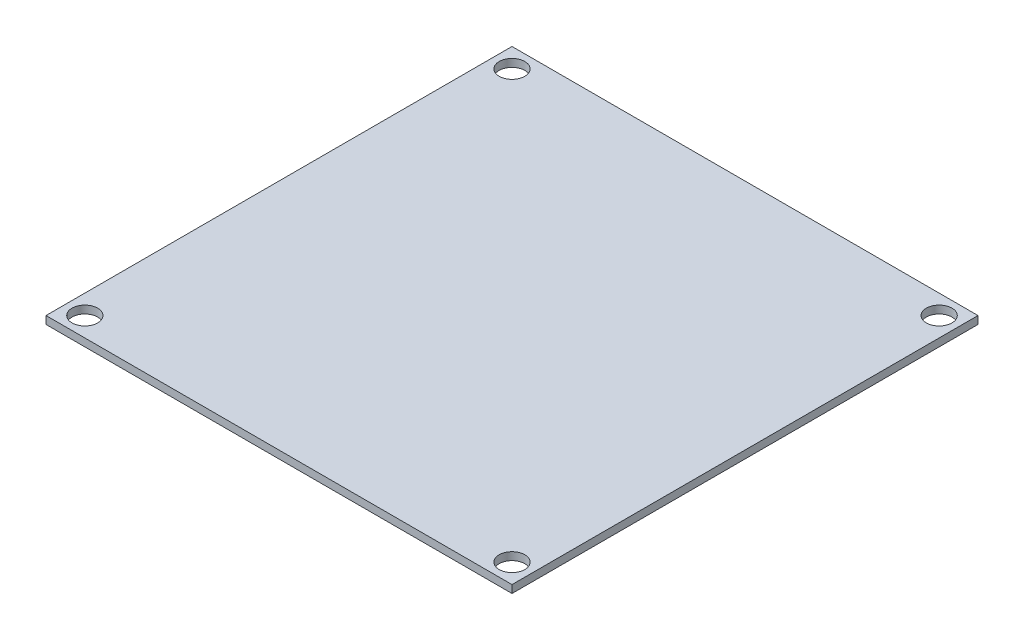
ISO-10303-21;
HEADER;
FILE_DESCRIPTION(('STEP AP214'),'2;1');
FILE_NAME('part.step','',(''),(''),'','','');
FILE_SCHEMA(('AUTOMOTIVE_DESIGN { 1 0 10303 214 1 1 1 1 }'));
ENDSEC;
DATA;
#1=APPLICATION_CONTEXT('core data for automotive mechanical design processes');
#2=APPLICATION_PROTOCOL_DEFINITION('international standard','automotive_design',2000,#1);
#3=PRODUCT_CONTEXT('',#1,'mechanical');
#4=PRODUCT('Part','Part','',(#3));
#5=PRODUCT_RELATED_PRODUCT_CATEGORY('part','',(#4));
#6=PRODUCT_DEFINITION_FORMATION('','',#4);
#7=PRODUCT_DEFINITION_CONTEXT('part definition',#1,'design');
#8=PRODUCT_DEFINITION('design','',#6,#7);
#9=PRODUCT_DEFINITION_SHAPE('','',#8);
#10=(LENGTH_UNIT() NAMED_UNIT(*) SI_UNIT(.MILLI.,.METRE.));
#11=(NAMED_UNIT(*) PLANE_ANGLE_UNIT() SI_UNIT($,.RADIAN.));
#12=(NAMED_UNIT(*) SI_UNIT($,.STERADIAN.) SOLID_ANGLE_UNIT());
#13=UNCERTAINTY_MEASURE_WITH_UNIT(LENGTH_MEASURE(1.E-05),#10,'distance_accuracy_value','');
#14=(GEOMETRIC_REPRESENTATION_CONTEXT(3) GLOBAL_UNCERTAINTY_ASSIGNED_CONTEXT((#13)) GLOBAL_UNIT_ASSIGNED_CONTEXT((#10,
#11,#12)) REPRESENTATION_CONTEXT('',''));
#15=CARTESIAN_POINT('',(0.,0.,0.));
#16=DIRECTION('',(0.,0.,1.));
#17=DIRECTION('',(1.,0.,0.));
#18=AXIS2_PLACEMENT_3D('',#15,#16,#17);
#19=CARTESIAN_POINT('',(0.,1.,0.));
#20=DIRECTION('',(0.,-1.,0.));
#21=DIRECTION('',(0.,0.,-1.));
#22=AXIS2_PLACEMENT_3D('',#19,#20,#21);
#23=PLANE('',#22);
#24=CARTESIAN_POINT('',(27.5,1.,-27.5));
#25=DIRECTION('',(0.,1.,0.));
#26=DIRECTION('',(0.,0.,1.));
#27=AXIS2_PLACEMENT_3D('',#24,#25,#26);
#28=CIRCLE('',#27,1.65);
#29=CARTESIAN_POINT('',(27.5,1.,-25.85));
#30=VERTEX_POINT('',#29);
#31=EDGE_CURVE('E135',#30,#30,#28,.T.);
#32=ORIENTED_EDGE('',*,*,#31,.F.);
#33=EDGE_LOOP('',(#32));
#34=FACE_BOUND('',#33,.T.);
#35=CARTESIAN_POINT('',(-27.5,1.,-27.5));
#36=DIRECTION('',(0.,1.,0.));
#37=DIRECTION('',(0.,0.,1.));
#38=AXIS2_PLACEMENT_3D('',#35,#36,#37);
#39=CIRCLE('',#38,1.65);
#40=CARTESIAN_POINT('',(-27.5,1.,-25.85));
#41=VERTEX_POINT('',#40);
#42=EDGE_CURVE('E117',#41,#41,#39,.F.);
#43=ORIENTED_EDGE('',*,*,#42,.T.);
#44=EDGE_LOOP('',(#43));
#45=FACE_BOUND('',#44,.T.);
#46=DIRECTION('',(0.,0.,-1.));
#47=VECTOR('',#46,1.);
#48=CARTESIAN_POINT('',(30.,1.,30.));
#49=LINE('',#48,#47);
#50=CARTESIAN_POINT('',(30.,1.,30.));
#51=VERTEX_POINT('',#50);
#52=CARTESIAN_POINT('',(30.,1.,-30.));
#53=VERTEX_POINT('',#52);
#54=EDGE_CURVE('E90',#51,#53,#49,.T.);
#55=ORIENTED_EDGE('',*,*,#54,.T.);
#56=DIRECTION('',(-1.,0.,0.));
#57=VECTOR('',#56,1.);
#58=CARTESIAN_POINT('',(-30.,1.,-30.));
#59=LINE('',#58,#57);
#60=CARTESIAN_POINT('',(-30.,1.,-30.));
#61=VERTEX_POINT('',#60);
#62=EDGE_CURVE('E85',#53,#61,#59,.T.);
#63=ORIENTED_EDGE('',*,*,#62,.T.);
#64=DIRECTION('',(0.,0.,1.));
#65=VECTOR('',#64,1.);
#66=CARTESIAN_POINT('',(-30.,1.,30.));
#67=LINE('',#66,#65);
#68=CARTESIAN_POINT('',(-30.,1.,30.));
#69=VERTEX_POINT('',#68);
#70=EDGE_CURVE('E88',#61,#69,#67,.T.);
#71=ORIENTED_EDGE('',*,*,#70,.T.);
#72=DIRECTION('',(1.,0.,0.));
#73=VECTOR('',#72,1.);
#74=CARTESIAN_POINT('',(-30.,1.,30.));
#75=LINE('',#74,#73);
#76=EDGE_CURVE('E55',#69,#51,#75,.T.);
#77=ORIENTED_EDGE('',*,*,#76,.T.);
#78=EDGE_LOOP('',(#55,#63,#71,#77));
#79=FACE_BOUND('',#78,.T.);
#80=CARTESIAN_POINT('',(27.5,1.,27.5));
#81=DIRECTION('',(0.,1.,0.));
#82=DIRECTION('',(0.,0.,1.));
#83=AXIS2_PLACEMENT_3D('',#80,#81,#82);
#84=CIRCLE('',#83,1.65);
#85=CARTESIAN_POINT('',(27.5,1.,29.15));
#86=VERTEX_POINT('',#85);
#87=EDGE_CURVE('E129',#86,#86,#84,.F.);
#88=ORIENTED_EDGE('',*,*,#87,.T.);
#89=EDGE_LOOP('',(#88));
#90=FACE_BOUND('',#89,.T.);
#91=CARTESIAN_POINT('',(-27.5,1.,27.5));
#92=DIRECTION('',(0.,1.,0.));
#93=DIRECTION('',(0.,0.,1.));
#94=AXIS2_PLACEMENT_3D('',#91,#92,#93);
#95=CIRCLE('',#94,1.65);
#96=CARTESIAN_POINT('',(-27.5,1.,29.15));
#97=VERTEX_POINT('',#96);
#98=EDGE_CURVE('E123',#97,#97,#95,.T.);
#99=ORIENTED_EDGE('',*,*,#98,.F.);
#100=EDGE_LOOP('',(#99));
#101=FACE_BOUND('',#100,.T.);
#102=ADVANCED_FACE('F38',(#34,#45,#79,#90,#101),#23,.F.);
#103=CARTESIAN_POINT('',(0.,0.,0.));
#104=DIRECTION('',(0.,-1.,0.));
#105=DIRECTION('',(0.,0.,-1.));
#106=AXIS2_PLACEMENT_3D('',#103,#104,#105);
#107=PLANE('',#106);
#108=CARTESIAN_POINT('',(27.5,0.,27.5));
#109=DIRECTION('',(0.,1.,0.));
#110=DIRECTION('',(0.,0.,1.));
#111=AXIS2_PLACEMENT_3D('',#108,#109,#110);
#112=CIRCLE('',#111,1.65);
#113=CARTESIAN_POINT('',(27.5,0.,29.15));
#114=VERTEX_POINT('',#113);
#115=EDGE_CURVE('E132',#114,#114,#112,.F.);
#116=ORIENTED_EDGE('',*,*,#115,.F.);
#117=EDGE_LOOP('',(#116));
#118=FACE_BOUND('',#117,.T.);
#119=CARTESIAN_POINT('',(-27.5,0.,-27.5));
#120=DIRECTION('',(0.,1.,0.));
#121=DIRECTION('',(0.,0.,1.));
#122=AXIS2_PLACEMENT_3D('',#119,#120,#121);
#123=CIRCLE('',#122,1.65);
#124=CARTESIAN_POINT('',(-27.5,0.,-25.85));
#125=VERTEX_POINT('',#124);
#126=EDGE_CURVE('E105',#125,#125,#123,.F.);
#127=ORIENTED_EDGE('',*,*,#126,.F.);
#128=EDGE_LOOP('',(#127));
#129=FACE_BOUND('',#128,.T.);
#130=DIRECTION('',(0.,0.,-1.));
#131=VECTOR('',#130,1.);
#132=CARTESIAN_POINT('',(30.,0.,30.));
#133=LINE('',#132,#131);
#134=CARTESIAN_POINT('',(30.,0.,30.));
#135=VERTEX_POINT('',#134);
#136=CARTESIAN_POINT('',(30.,0.,-30.));
#137=VERTEX_POINT('',#136);
#138=EDGE_CURVE('E102',#135,#137,#133,.T.);
#139=ORIENTED_EDGE('',*,*,#138,.F.);
#140=DIRECTION('',(1.,0.,0.));
#141=VECTOR('',#140,1.);
#142=CARTESIAN_POINT('',(-30.,0.,30.));
#143=LINE('',#142,#141);
#144=CARTESIAN_POINT('',(-30.,0.,30.));
#145=VERTEX_POINT('',#144);
#146=EDGE_CURVE('E78',#145,#135,#143,.T.);
#147=ORIENTED_EDGE('',*,*,#146,.F.);
#148=DIRECTION('',(0.,0.,1.));
#149=VECTOR('',#148,1.);
#150=CARTESIAN_POINT('',(-30.,0.,30.));
#151=LINE('',#150,#149);
#152=CARTESIAN_POINT('',(-30.,0.,-30.));
#153=VERTEX_POINT('',#152);
#154=EDGE_CURVE('E72',#153,#145,#151,.T.);
#155=ORIENTED_EDGE('',*,*,#154,.F.);
#156=DIRECTION('',(-1.,0.,0.));
#157=VECTOR('',#156,1.);
#158=CARTESIAN_POINT('',(-30.,0.,-30.));
#159=LINE('',#158,#157);
#160=EDGE_CURVE('E94',#137,#153,#159,.T.);
#161=ORIENTED_EDGE('',*,*,#160,.F.);
#162=EDGE_LOOP('',(#139,#147,#155,#161));
#163=FACE_BOUND('',#162,.T.);
#164=CARTESIAN_POINT('',(27.5,0.,-27.5));
#165=DIRECTION('',(0.,1.,0.));
#166=DIRECTION('',(0.,0.,1.));
#167=AXIS2_PLACEMENT_3D('',#164,#165,#166);
#168=CIRCLE('',#167,1.65);
#169=CARTESIAN_POINT('',(27.5,0.,-25.85));
#170=VERTEX_POINT('',#169);
#171=EDGE_CURVE('E120',#170,#170,#168,.T.);
#172=ORIENTED_EDGE('',*,*,#171,.T.);
#173=EDGE_LOOP('',(#172));
#174=FACE_BOUND('',#173,.T.);
#175=CARTESIAN_POINT('',(-27.5,0.,27.5));
#176=DIRECTION('',(0.,1.,0.));
#177=DIRECTION('',(0.,0.,1.));
#178=AXIS2_PLACEMENT_3D('',#175,#176,#177);
#179=CIRCLE('',#178,1.65);
#180=CARTESIAN_POINT('',(-27.5,0.,29.15));
#181=VERTEX_POINT('',#180);
#182=EDGE_CURVE('E126',#181,#181,#179,.T.);
#183=ORIENTED_EDGE('',*,*,#182,.T.);
#184=EDGE_LOOP('',(#183));
#185=FACE_BOUND('',#184,.T.);
#186=ADVANCED_FACE('F113',(#118,#129,#163,#174,#185),#107,.T.);
#187=CARTESIAN_POINT('',(30.,1.,30.));
#188=DIRECTION('',(-1.,0.,0.));
#189=DIRECTION('',(0.,0.,1.));
#190=AXIS2_PLACEMENT_3D('',#187,#188,#189);
#191=PLANE('',#190);
#192=ORIENTED_EDGE('',*,*,#138,.T.);
#193=DIRECTION('',(0.,-1.,0.));
#194=VECTOR('',#193,1.);
#195=CARTESIAN_POINT('',(30.,1.,-30.));
#196=LINE('',#195,#194);
#197=EDGE_CURVE('E11',#53,#137,#196,.T.);
#198=ORIENTED_EDGE('',*,*,#197,.F.);
#199=ORIENTED_EDGE('',*,*,#54,.F.);
#200=DIRECTION('',(0.,-1.,0.));
#201=VECTOR('',#200,1.);
#202=CARTESIAN_POINT('',(30.,1.,30.));
#203=LINE('',#202,#201);
#204=EDGE_CURVE('E98',#51,#135,#203,.T.);
#205=ORIENTED_EDGE('',*,*,#204,.T.);
#206=EDGE_LOOP('',(#192,#198,#199,#205));
#207=FACE_BOUND('',#206,.T.);
#208=ADVANCED_FACE('F40',(#207),#191,.F.);
#209=CARTESIAN_POINT('',(-30.,1.,-30.));
#210=DIRECTION('',(0.,0.,1.));
#211=DIRECTION('',(1.,0.,0.));
#212=AXIS2_PLACEMENT_3D('',#209,#210,#211);
#213=PLANE('',#212);
#214=ORIENTED_EDGE('',*,*,#160,.T.);
#215=DIRECTION('',(0.,-1.,0.));
#216=VECTOR('',#215,1.);
#217=CARTESIAN_POINT('',(-30.,1.,-30.));
#218=LINE('',#217,#216);
#219=EDGE_CURVE('E47',#61,#153,#218,.T.);
#220=ORIENTED_EDGE('',*,*,#219,.F.);
#221=ORIENTED_EDGE('',*,*,#62,.F.);
#222=ORIENTED_EDGE('',*,*,#197,.T.);
#223=EDGE_LOOP('',(#214,#220,#221,#222));
#224=FACE_BOUND('',#223,.T.);
#225=ADVANCED_FACE('F93',(#224),#213,.F.);
#226=CARTESIAN_POINT('',(-30.,1.,30.));
#227=DIRECTION('',(1.,0.,0.));
#228=DIRECTION('',(0.,0.,-1.));
#229=AXIS2_PLACEMENT_3D('',#226,#227,#228);
#230=PLANE('',#229);
#231=ORIENTED_EDGE('',*,*,#154,.T.);
#232=DIRECTION('',(0.,-1.,0.));
#233=VECTOR('',#232,1.);
#234=CARTESIAN_POINT('',(-30.,1.,30.));
#235=LINE('',#234,#233);
#236=EDGE_CURVE('E95',#69,#145,#235,.T.);
#237=ORIENTED_EDGE('',*,*,#236,.F.);
#238=ORIENTED_EDGE('',*,*,#70,.F.);
#239=ORIENTED_EDGE('',*,*,#219,.T.);
#240=EDGE_LOOP('',(#231,#237,#238,#239));
#241=FACE_BOUND('',#240,.T.);
#242=ADVANCED_FACE('F96',(#241),#230,.F.);
#243=CARTESIAN_POINT('',(-30.,1.,30.));
#244=DIRECTION('',(0.,0.,-1.));
#245=DIRECTION('',(-1.,0.,0.));
#246=AXIS2_PLACEMENT_3D('',#243,#244,#245);
#247=PLANE('',#246);
#248=ORIENTED_EDGE('',*,*,#146,.T.);
#249=ORIENTED_EDGE('',*,*,#204,.F.);
#250=ORIENTED_EDGE('',*,*,#76,.F.);
#251=ORIENTED_EDGE('',*,*,#236,.T.);
#252=EDGE_LOOP('',(#248,#249,#250,#251));
#253=FACE_BOUND('',#252,.T.);
#254=ADVANCED_FACE('F110',(#253),#247,.F.);
#255=CARTESIAN_POINT('',(-27.5,0.,-27.5));
#256=DIRECTION('',(0.,1.,0.));
#257=DIRECTION('',(0.,0.,1.));
#258=AXIS2_PLACEMENT_3D('',#255,#256,#257);
#259=CYLINDRICAL_SURFACE('',#258,1.65);
#260=ORIENTED_EDGE('',*,*,#126,.T.);
#261=EDGE_LOOP('',(#260));
#262=FACE_BOUND('',#261,.T.);
#263=ORIENTED_EDGE('',*,*,#42,.F.);
#264=EDGE_LOOP('',(#263));
#265=FACE_BOUND('',#264,.T.);
#266=ADVANCED_FACE('F146',(#262,#265),#259,.F.);
#267=CARTESIAN_POINT('',(27.5,0.,-27.5));
#268=DIRECTION('',(0.,1.,0.));
#269=DIRECTION('',(0.,0.,1.));
#270=AXIS2_PLACEMENT_3D('',#267,#268,#269);
#271=CYLINDRICAL_SURFACE('',#270,1.65);
#272=ORIENTED_EDGE('',*,*,#171,.F.);
#273=EDGE_LOOP('',(#272));
#274=FACE_BOUND('',#273,.T.);
#275=ORIENTED_EDGE('',*,*,#31,.T.);
#276=EDGE_LOOP('',(#275));
#277=FACE_BOUND('',#276,.T.);
#278=ADVANCED_FACE('F142',(#274,#277),#271,.F.);
#279=CARTESIAN_POINT('',(27.5,0.,27.5));
#280=DIRECTION('',(0.,1.,0.));
#281=DIRECTION('',(0.,0.,1.));
#282=AXIS2_PLACEMENT_3D('',#279,#280,#281);
#283=CYLINDRICAL_SURFACE('',#282,1.65);
#284=ORIENTED_EDGE('',*,*,#115,.T.);
#285=EDGE_LOOP('',(#284));
#286=FACE_BOUND('',#285,.T.);
#287=ORIENTED_EDGE('',*,*,#87,.F.);
#288=EDGE_LOOP('',(#287));
#289=FACE_BOUND('',#288,.T.);
#290=ADVANCED_FACE('F145',(#286,#289),#283,.F.);
#291=CARTESIAN_POINT('',(-27.5,0.,27.5));
#292=DIRECTION('',(0.,1.,0.));
#293=DIRECTION('',(0.,0.,1.));
#294=AXIS2_PLACEMENT_3D('',#291,#292,#293);
#295=CYLINDRICAL_SURFACE('',#294,1.65);
#296=ORIENTED_EDGE('',*,*,#182,.F.);
#297=EDGE_LOOP('',(#296));
#298=FACE_BOUND('',#297,.T.);
#299=ORIENTED_EDGE('',*,*,#98,.T.);
#300=EDGE_LOOP('',(#299));
#301=FACE_BOUND('',#300,.T.);
#302=ADVANCED_FACE('F163',(#298,#301),#295,.F.);
#303=CLOSED_SHELL('',(#102,#186,#208,#225,#242,#254,#266,#278,#290,#302));
#304=MANIFOLD_SOLID_BREP('B2',#303);
#305=ADVANCED_BREP_SHAPE_REPRESENTATION('',(#18,#304),#14);
#306=SHAPE_DEFINITION_REPRESENTATION(#9,#305);
ENDSEC;
END-ISO-10303-21;
